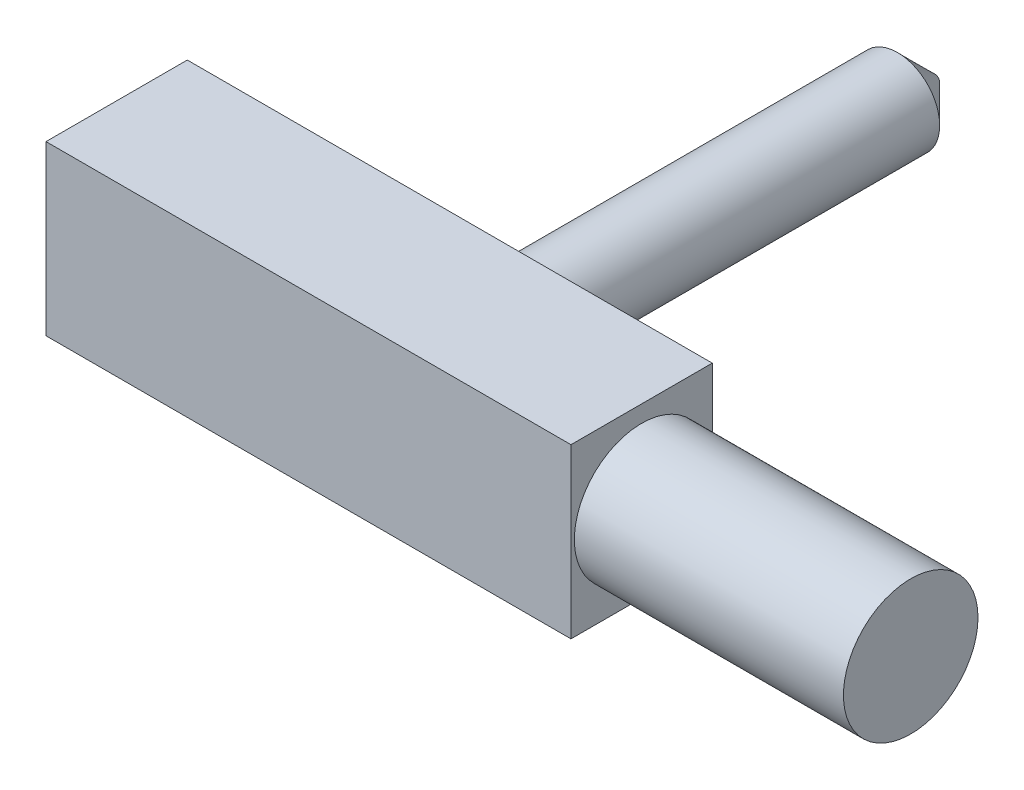
ISO-10303-21;
HEADER;
FILE_DESCRIPTION(('STEP AP214'),'2;1');
FILE_NAME('part.step','',(''),(''),'','','');
FILE_SCHEMA(('AUTOMOTIVE_DESIGN { 1 0 10303 214 1 1 1 1 }'));
ENDSEC;
DATA;
#1=APPLICATION_CONTEXT('core data for automotive mechanical design processes');
#2=APPLICATION_PROTOCOL_DEFINITION('international standard','automotive_design',2000,#1);
#3=PRODUCT_CONTEXT('',#1,'mechanical');
#4=PRODUCT('Part','Part','',(#3));
#5=PRODUCT_RELATED_PRODUCT_CATEGORY('part','',(#4));
#6=PRODUCT_DEFINITION_FORMATION('','',#4);
#7=PRODUCT_DEFINITION_CONTEXT('part definition',#1,'design');
#8=PRODUCT_DEFINITION('design','',#6,#7);
#9=PRODUCT_DEFINITION_SHAPE('','',#8);
#10=(LENGTH_UNIT() NAMED_UNIT(*) SI_UNIT(.MILLI.,.METRE.));
#11=(NAMED_UNIT(*) PLANE_ANGLE_UNIT() SI_UNIT($,.RADIAN.));
#12=(NAMED_UNIT(*) SI_UNIT($,.STERADIAN.) SOLID_ANGLE_UNIT());
#13=UNCERTAINTY_MEASURE_WITH_UNIT(LENGTH_MEASURE(1.E-05),#10,'distance_accuracy_value','');
#14=(GEOMETRIC_REPRESENTATION_CONTEXT(3) GLOBAL_UNCERTAINTY_ASSIGNED_CONTEXT((#13)) GLOBAL_UNIT_ASSIGNED_CONTEXT((#10,
#11,#12)) REPRESENTATION_CONTEXT('',''));
#15=CARTESIAN_POINT('',(0.,0.,0.));
#16=DIRECTION('',(0.,0.,1.));
#17=DIRECTION('',(1.,0.,0.));
#18=AXIS2_PLACEMENT_3D('',#15,#16,#17);
#19=CARTESIAN_POINT('',(-39.015,-12.5,-21.));
#20=DIRECTION('',(-1.,0.,0.));
#21=DIRECTION('',(0.,0.,1.));
#22=AXIS2_PLACEMENT_3D('',#19,#20,#21);
#23=PLANE('',#22);
#24=DIRECTION('',(0.,-1.,0.));
#25=VECTOR('',#24,1.);
#26=CARTESIAN_POINT('',(-39.015,-12.5,0.));
#27=LINE('',#26,#25);
#28=CARTESIAN_POINT('',(-39.015,12.5,0.));
#29=VERTEX_POINT('',#28);
#30=CARTESIAN_POINT('',(-39.015,-12.5,0.));
#31=VERTEX_POINT('',#30);
#32=EDGE_CURVE('E117',#29,#31,#27,.T.);
#33=ORIENTED_EDGE('',*,*,#32,.F.);
#34=DIRECTION('',(0.,0.,1.));
#35=VECTOR('',#34,1.);
#36=CARTESIAN_POINT('',(-39.015,12.5,-21.));
#37=LINE('',#36,#35);
#38=CARTESIAN_POINT('',(-39.015,12.5,-21.));
#39=VERTEX_POINT('',#38);
#40=EDGE_CURVE('E60',#39,#29,#37,.T.);
#41=ORIENTED_EDGE('',*,*,#40,.F.);
#42=DIRECTION('',(0.,-1.,0.));
#43=VECTOR('',#42,1.);
#44=CARTESIAN_POINT('',(-39.015,-12.5,-21.));
#45=LINE('',#44,#43);
#46=CARTESIAN_POINT('',(-39.015,-12.5,-21.));
#47=VERTEX_POINT('',#46);
#48=EDGE_CURVE('E108',#39,#47,#45,.T.);
#49=ORIENTED_EDGE('',*,*,#48,.T.);
#50=DIRECTION('',(0.,0.,1.));
#51=VECTOR('',#50,1.);
#52=CARTESIAN_POINT('',(-39.015,-12.5,-21.));
#53=LINE('',#52,#51);
#54=EDGE_CURVE('E88',#47,#31,#53,.T.);
#55=ORIENTED_EDGE('',*,*,#54,.T.);
#56=EDGE_LOOP('',(#33,#41,#49,#55));
#57=FACE_BOUND('',#56,.T.);
#58=ADVANCED_FACE('F41',(#57),#23,.T.);
#59=CARTESIAN_POINT('',(39.015,12.5,-21.));
#60=DIRECTION('',(0.,1.,0.));
#61=DIRECTION('',(-1.,0.,0.));
#62=AXIS2_PLACEMENT_3D('',#59,#60,#61);
#63=PLANE('',#62);
#64=DIRECTION('',(-1.,0.,0.));
#65=VECTOR('',#64,1.);
#66=CARTESIAN_POINT('',(39.015,12.5,0.));
#67=LINE('',#66,#65);
#68=CARTESIAN_POINT('',(39.015,12.5,0.));
#69=VERTEX_POINT('',#68);
#70=EDGE_CURVE('E111',#69,#29,#67,.T.);
#71=ORIENTED_EDGE('',*,*,#70,.F.);
#72=DIRECTION('',(0.,0.,1.));
#73=VECTOR('',#72,1.);
#74=CARTESIAN_POINT('',(39.015,12.5,-21.));
#75=LINE('',#74,#73);
#76=CARTESIAN_POINT('',(39.015,12.5,-21.));
#77=VERTEX_POINT('',#76);
#78=EDGE_CURVE('E77',#77,#69,#75,.T.);
#79=ORIENTED_EDGE('',*,*,#78,.F.);
#80=DIRECTION('',(-1.,0.,0.));
#81=VECTOR('',#80,1.);
#82=CARTESIAN_POINT('',(39.015,12.5,-21.));
#83=LINE('',#82,#81);
#84=EDGE_CURVE('E103',#77,#39,#83,.T.);
#85=ORIENTED_EDGE('',*,*,#84,.T.);
#86=ORIENTED_EDGE('',*,*,#40,.T.);
#87=EDGE_LOOP('',(#71,#79,#85,#86));
#88=FACE_BOUND('',#87,.T.);
#89=ADVANCED_FACE('F163',(#88),#63,.T.);
#90=CARTESIAN_POINT('',(39.015,-12.5,-21.));
#91=DIRECTION('',(1.,0.,0.));
#92=DIRECTION('',(0.,0.,-1.));
#93=AXIS2_PLACEMENT_3D('',#90,#91,#92);
#94=PLANE('',#93);
#95=CARTESIAN_POINT('',(39.015,0.,-10.5));
#96=DIRECTION('',(1.,0.,0.));
#97=DIRECTION('',(0.,0.,-1.));
#98=AXIS2_PLACEMENT_3D('',#95,#96,#97);
#99=CIRCLE('',#98,10.);
#100=CARTESIAN_POINT('',(39.015,0.,-20.5));
#101=VERTEX_POINT('',#100);
#102=EDGE_CURVE('E132',#101,#101,#99,.T.);
#103=ORIENTED_EDGE('',*,*,#102,.F.);
#104=EDGE_LOOP('',(#103));
#105=FACE_BOUND('',#104,.T.);
#106=DIRECTION('',(0.,1.,0.));
#107=VECTOR('',#106,1.);
#108=CARTESIAN_POINT('',(39.015,-12.5,0.));
#109=LINE('',#108,#107);
#110=CARTESIAN_POINT('',(39.015,-12.5,0.));
#111=VERTEX_POINT('',#110);
#112=EDGE_CURVE('E96',#111,#69,#109,.T.);
#113=ORIENTED_EDGE('',*,*,#112,.F.);
#114=DIRECTION('',(0.,0.,1.));
#115=VECTOR('',#114,1.);
#116=CARTESIAN_POINT('',(39.015,-12.5,-21.));
#117=LINE('',#116,#115);
#118=CARTESIAN_POINT('',(39.015,-12.5,-21.));
#119=VERTEX_POINT('',#118);
#120=EDGE_CURVE('E91',#119,#111,#117,.T.);
#121=ORIENTED_EDGE('',*,*,#120,.F.);
#122=DIRECTION('',(0.,1.,0.));
#123=VECTOR('',#122,1.);
#124=CARTESIAN_POINT('',(39.015,-12.5,-21.));
#125=LINE('',#124,#123);
#126=EDGE_CURVE('E94',#119,#77,#125,.T.);
#127=ORIENTED_EDGE('',*,*,#126,.T.);
#128=ORIENTED_EDGE('',*,*,#78,.T.);
#129=EDGE_LOOP('',(#113,#121,#127,#128));
#130=FACE_BOUND('',#129,.T.);
#131=ADVANCED_FACE('F93',(#105,#130),#94,.T.);
#132=CARTESIAN_POINT('',(39.015,-12.5,-21.));
#133=DIRECTION('',(0.,-1.,0.));
#134=DIRECTION('',(1.,0.,0.));
#135=AXIS2_PLACEMENT_3D('',#132,#133,#134);
#136=PLANE('',#135);
#137=DIRECTION('',(1.,0.,0.));
#138=VECTOR('',#137,1.);
#139=CARTESIAN_POINT('',(39.015,-12.5,0.));
#140=LINE('',#139,#138);
#141=EDGE_CURVE('E121',#31,#111,#140,.T.);
#142=ORIENTED_EDGE('',*,*,#141,.F.);
#143=ORIENTED_EDGE('',*,*,#54,.F.);
#144=DIRECTION('',(1.,0.,0.));
#145=VECTOR('',#144,1.);
#146=CARTESIAN_POINT('',(39.015,-12.5,-21.));
#147=LINE('',#146,#145);
#148=EDGE_CURVE('E102',#47,#119,#147,.T.);
#149=ORIENTED_EDGE('',*,*,#148,.T.);
#150=ORIENTED_EDGE('',*,*,#120,.T.);
#151=EDGE_LOOP('',(#142,#143,#149,#150));
#152=FACE_BOUND('',#151,.T.);
#153=ADVANCED_FACE('F106',(#152),#136,.T.);
#154=CARTESIAN_POINT('',(0.,0.,-21.));
#155=DIRECTION('',(0.,0.,1.));
#156=DIRECTION('',(1.,0.,0.));
#157=AXIS2_PLACEMENT_3D('',#154,#155,#156);
#158=PLANE('',#157);
#159=CARTESIAN_POINT('',(6.565,0.,-21.));
#160=DIRECTION('',(0.,0.,-1.));
#161=DIRECTION('',(-1.,0.,0.));
#162=AXIS2_PLACEMENT_3D('',#159,#160,#161);
#163=CIRCLE('',#162,6.25);
#164=CARTESIAN_POINT('',(0.315000000000001,0.,-21.));
#165=VERTEX_POINT('',#164);
#166=EDGE_CURVE('E138',#165,#165,#163,.T.);
#167=ORIENTED_EDGE('',*,*,#166,.F.);
#168=EDGE_LOOP('',(#167));
#169=FACE_BOUND('',#168,.T.);
#170=ORIENTED_EDGE('',*,*,#48,.F.);
#171=ORIENTED_EDGE('',*,*,#84,.F.);
#172=ORIENTED_EDGE('',*,*,#126,.F.);
#173=ORIENTED_EDGE('',*,*,#148,.F.);
#174=EDGE_LOOP('',(#170,#171,#172,#173));
#175=FACE_BOUND('',#174,.T.);
#176=ADVANCED_FACE('F101',(#169,#175),#158,.F.);
#177=CARTESIAN_POINT('',(0.,0.,0.));
#178=DIRECTION('',(0.,0.,1.));
#179=DIRECTION('',(1.,0.,0.));
#180=AXIS2_PLACEMENT_3D('',#177,#178,#179);
#181=PLANE('',#180);
#182=ORIENTED_EDGE('',*,*,#32,.T.);
#183=ORIENTED_EDGE('',*,*,#141,.T.);
#184=ORIENTED_EDGE('',*,*,#112,.T.);
#185=ORIENTED_EDGE('',*,*,#70,.T.);
#186=EDGE_LOOP('',(#182,#183,#184,#185));
#187=FACE_BOUND('',#186,.T.);
#188=ADVANCED_FACE('F158',(#187),#181,.T.);
#189=CARTESIAN_POINT('',(79.015,0.,-10.5));
#190=DIRECTION('',(-1.,0.,0.));
#191=DIRECTION('',(0.,0.,1.));
#192=AXIS2_PLACEMENT_3D('',#189,#190,#191);
#193=CYLINDRICAL_SURFACE('',#192,10.);
#194=CARTESIAN_POINT('',(79.015,0.,-10.5));
#195=DIRECTION('',(1.,0.,0.));
#196=DIRECTION('',(0.,0.,-1.));
#197=AXIS2_PLACEMENT_3D('',#194,#195,#196);
#198=CIRCLE('',#197,10.);
#199=CARTESIAN_POINT('',(79.015,0.,-20.5));
#200=VERTEX_POINT('',#199);
#201=EDGE_CURVE('E122',#200,#200,#198,.T.);
#202=ORIENTED_EDGE('',*,*,#201,.F.);
#203=EDGE_LOOP('',(#202));
#204=FACE_BOUND('',#203,.T.);
#205=ORIENTED_EDGE('',*,*,#102,.T.);
#206=EDGE_LOOP('',(#205));
#207=FACE_BOUND('',#206,.T.);
#208=ADVANCED_FACE('F155',(#204,#207),#193,.T.);
#209=CARTESIAN_POINT('',(79.015,0.,-10.5));
#210=DIRECTION('',(1.,0.,0.));
#211=DIRECTION('',(0.,0.,-1.));
#212=AXIS2_PLACEMENT_3D('',#209,#210,#211);
#213=PLANE('',#212);
#214=ORIENTED_EDGE('',*,*,#201,.T.);
#215=EDGE_LOOP('',(#214));
#216=FACE_BOUND('',#215,.T.);
#217=ADVANCED_FACE('F153',(#216),#213,.T.);
#218=CARTESIAN_POINT('',(6.565,0.,-86.56));
#219=DIRECTION('',(0.,0.,1.));
#220=DIRECTION('',(1.,0.,0.));
#221=AXIS2_PLACEMENT_3D('',#218,#219,#220);
#222=CYLINDRICAL_SURFACE('',#221,6.25);
#223=CARTESIAN_POINT('',(6.565,0.,-81.));
#224=DIRECTION('',(0.,0.,-1.));
#225=DIRECTION('',(-1.,0.,0.));
#226=AXIS2_PLACEMENT_3D('',#223,#224,#225);
#227=CIRCLE('',#226,6.25);
#228=CARTESIAN_POINT('',(12.815,0.,-81.));
#229=VERTEX_POINT('',#228);
#230=EDGE_CURVE('E11',#229,#229,#227,.F.);
#231=ORIENTED_EDGE('',*,*,#230,.T.);
#232=EDGE_LOOP('',(#231));
#233=FACE_BOUND('',#232,.T.);
#234=ORIENTED_EDGE('',*,*,#166,.T.);
#235=EDGE_LOOP('',(#234));
#236=FACE_BOUND('',#235,.T.);
#237=ADVANCED_FACE('F185',(#233,#236),#222,.T.);
#238=CARTESIAN_POINT('',(6.565,0.,-86.56));
#239=DIRECTION('',(0.,0.,-1.));
#240=DIRECTION('',(-1.,0.,0.));
#241=AXIS2_PLACEMENT_3D('',#238,#239,#240);
#242=PLANE('',#241);
#243=CARTESIAN_POINT('',(6.565,0.,-86.56));
#244=DIRECTION('',(0.,0.,-1.));
#245=DIRECTION('',(-1.,0.,0.));
#246=AXIS2_PLACEMENT_3D('',#243,#244,#245);
#247=CIRCLE('',#246,0.690000000000038);
#248=CARTESIAN_POINT('',(7.25500000000005,0.,-86.56));
#249=VERTEX_POINT('',#248);
#250=EDGE_CURVE('E52',#249,#249,#247,.T.);
#251=ORIENTED_EDGE('',*,*,#250,.T.);
#252=EDGE_LOOP('',(#251));
#253=FACE_BOUND('',#252,.T.);
#254=ADVANCED_FACE('F188',(#253),#242,.T.);
#255=CARTESIAN_POINT('',(6.565,0.,-86.56));
#256=DIRECTION('',(0.,0.,1.));
#257=DIRECTION('',(1.,0.,0.));
#258=AXIS2_PLACEMENT_3D('',#255,#256,#257);
#259=CONICAL_SURFACE('',#258,0.690000000000038,0.785398163397445);
#260=CARTESIAN_POINT('',(12.815,0.,-81.));
#261=CARTESIAN_POINT('',(12.7570833333333,0.,-81.0579166666667));
#262=CARTESIAN_POINT('',(12.6991666666667,0.,-81.1158333333334));
#263=CARTESIAN_POINT('',(12.5833333333333,0.,-81.2316666666667));
#264=CARTESIAN_POINT('',(12.5254166666667,0.,-81.2895833333333));
#265=CARTESIAN_POINT('',(12.4095833333333,0.,-81.4054166666667));
#266=CARTESIAN_POINT('',(12.3516666666667,0.,-81.4633333333333));
#267=CARTESIAN_POINT('',(12.2358333333333,0.,-81.5791666666667));
#268=CARTESIAN_POINT('',(12.1779166666667,0.,-81.6370833333333));
#269=CARTESIAN_POINT('',(12.0620833333333,0.,-81.7529166666667));
#270=CARTESIAN_POINT('',(12.0041666666667,0.,-81.8108333333333));
#271=CARTESIAN_POINT('',(11.8883333333333,0.,-81.9266666666667));
#272=CARTESIAN_POINT('',(11.8304166666667,0.,-81.9845833333333));
#273=CARTESIAN_POINT('',(11.7145833333333,0.,-82.1004166666667));
#274=CARTESIAN_POINT('',(11.6566666666667,0.,-82.1583333333333));
#275=CARTESIAN_POINT('',(11.5408333333334,0.,-82.2741666666667));
#276=CARTESIAN_POINT('',(11.4829166666667,0.,-82.3320833333333));
#277=CARTESIAN_POINT('',(11.3670833333334,0.,-82.4479166666667));
#278=CARTESIAN_POINT('',(11.3091666666667,0.,-82.5058333333333));
#279=CARTESIAN_POINT('',(11.1933333333334,0.,-82.6216666666667));
#280=CARTESIAN_POINT('',(11.1354166666667,0.,-82.6795833333333));
#281=CARTESIAN_POINT('',(11.0195833333334,0.,-82.7954166666667));
#282=CARTESIAN_POINT('',(10.9616666666667,0.,-82.8533333333333));
#283=CARTESIAN_POINT('',(10.8458333333334,0.,-82.9691666666667));
#284=CARTESIAN_POINT('',(10.7879166666667,0.,-83.0270833333333));
#285=CARTESIAN_POINT('',(10.6720833333334,0.,-83.1429166666667));
#286=CARTESIAN_POINT('',(10.6141666666667,0.,-83.2008333333333));
#287=CARTESIAN_POINT('',(10.4983333333334,0.,-83.3166666666667));
#288=CARTESIAN_POINT('',(10.4404166666667,0.,-83.3745833333333));
#289=CARTESIAN_POINT('',(10.3245833333334,0.,-83.4904166666667));
#290=CARTESIAN_POINT('',(10.2666666666667,0.,-83.5483333333333));
#291=CARTESIAN_POINT('',(10.1508333333334,0.,-83.6641666666667));
#292=CARTESIAN_POINT('',(10.0929166666667,0.,-83.7220833333333));
#293=CARTESIAN_POINT('',(9.97708333333336,0.,-83.8379166666667));
#294=CARTESIAN_POINT('',(9.91916666666669,0.,-83.8958333333333));
#295=CARTESIAN_POINT('',(9.80333333333336,0.,-84.0116666666667));
#296=CARTESIAN_POINT('',(9.7454166666667,0.,-84.0695833333333));
#297=CARTESIAN_POINT('',(9.62958333333336,0.,-84.1854166666667));
#298=CARTESIAN_POINT('',(9.5716666666667,0.,-84.2433333333333));
#299=CARTESIAN_POINT('',(9.45583333333336,0.,-84.3591666666667));
#300=CARTESIAN_POINT('',(9.3979166666667,0.,-84.4170833333333));
#301=CARTESIAN_POINT('',(9.28208333333337,0.,-84.5329166666667));
#302=CARTESIAN_POINT('',(9.2241666666667,0.,-84.5908333333333));
#303=CARTESIAN_POINT('',(9.10833333333337,0.,-84.7066666666667));
#304=CARTESIAN_POINT('',(9.0504166666667,0.,-84.7645833333333));
#305=CARTESIAN_POINT('',(8.93458333333337,0.,-84.8804166666667));
#306=CARTESIAN_POINT('',(8.8766666666667,0.,-84.9383333333333));
#307=CARTESIAN_POINT('',(8.76083333333337,0.,-85.0541666666667));
#308=CARTESIAN_POINT('',(8.7029166666667,0.,-85.1120833333333));
#309=CARTESIAN_POINT('',(8.58708333333337,0.,-85.2279166666667));
#310=CARTESIAN_POINT('',(8.5291666666667,0.,-85.2858333333333));
#311=CARTESIAN_POINT('',(8.41333333333337,0.,-85.4016666666667));
#312=CARTESIAN_POINT('',(8.35541666666671,0.,-85.4595833333333));
#313=CARTESIAN_POINT('',(8.23958333333337,0.,-85.5754166666667));
#314=CARTESIAN_POINT('',(8.18166666666671,0.,-85.6333333333333));
#315=CARTESIAN_POINT('',(8.06583333333337,0.,-85.7491666666667));
#316=CARTESIAN_POINT('',(8.00791666666671,0.,-85.8070833333333));
#317=CARTESIAN_POINT('',(7.89208333333338,0.,-85.9229166666667));
#318=CARTESIAN_POINT('',(7.83416666666671,0.,-85.9808333333333));
#319=CARTESIAN_POINT('',(7.71833333333338,0.,-86.0966666666667));
#320=CARTESIAN_POINT('',(7.66041666666671,0.,-86.1545833333333));
#321=CARTESIAN_POINT('',(7.54458333333338,0.,-86.2704166666667));
#322=CARTESIAN_POINT('',(7.48666666666671,0.,-86.3283333333333));
#323=CARTESIAN_POINT('',(7.37083333333338,0.,-86.4441666666667));
#324=CARTESIAN_POINT('',(7.31291666666671,0.,-86.5020833333333));
#325=CARTESIAN_POINT('',(7.25500000000005,0.,-86.56));
#326=B_SPLINE_CURVE_WITH_KNOTS('',3,(#260,#261,#262,#263,#264,#265,#266,#267,#268,#269,#270,
#271,#272,#273,#274,#275,#276,#277,#278,#279,#280,#281,#282,#283,#284,#285,#286,#287,#288,#289,
#290,#291,#292,#293,#294,#295,#296,#297,#298,#299,#300,#301,#302,#303,#304,#305,#306,#307,#308,
#309,#310,#311,#312,#313,#314,#315,#316,#317,#318,#319,#320,#321,#322,#323,#324,#325),
.UNSPECIFIED.,.F.,.F.,(4,2,2,2,2,2,2,2,2,2,2,2,2,2,2,2,2,2,2,2,2,2,2,2,2,2,2,2,2,2,2,2,4),(0.,
0.245719606462324,0.49143921292464,0.737158819386964,0.982878425849289,1.22859803231161,
1.47431763877394,1.72003724523626,1.96575685169859,2.21147645816091,2.45719606462324,
2.70291567108556,2.94863527754789,3.19435488401021,3.44007449047254,3.68579409693486,
3.93151370339719,4.17723330985951,4.42295291632183,4.66867252278416,4.91439212924648,
5.16011173570881,5.40583134217113,5.65155094863346,5.89727055509578,6.1429901615581,
6.38870976802043,6.63442937448275,6.88014898094508,7.1258685874074,7.37158819386973,
7.61730780033204,7.86302740679437),.UNSPECIFIED.);
#327=EDGE_CURVE('BSEAM44',#229,#249,#326,.T.);
#328=ORIENTED_EDGE('',*,*,#230,.F.);
#329=ORIENTED_EDGE('',*,*,#250,.F.);
#330=ORIENTED_EDGE('',*,*,#327,.T.);
#331=ORIENTED_EDGE('',*,*,#327,.F.);
#332=EDGE_LOOP('',(#328,#330,#329,#331));
#333=FACE_BOUND('',#332,.T.);
#334=ADVANCED_FACE('F44',(#333),#259,.T.);
#335=CLOSED_SHELL('',(#58,#89,#131,#153,#176,#188,#208,#217,#237,#254,#334));
#336=MANIFOLD_SOLID_BREP('B2',#335);
#337=ADVANCED_BREP_SHAPE_REPRESENTATION('',(#18,#336),#14);
#338=SHAPE_DEFINITION_REPRESENTATION(#9,#337);
ENDSEC;
END-ISO-10303-21;
